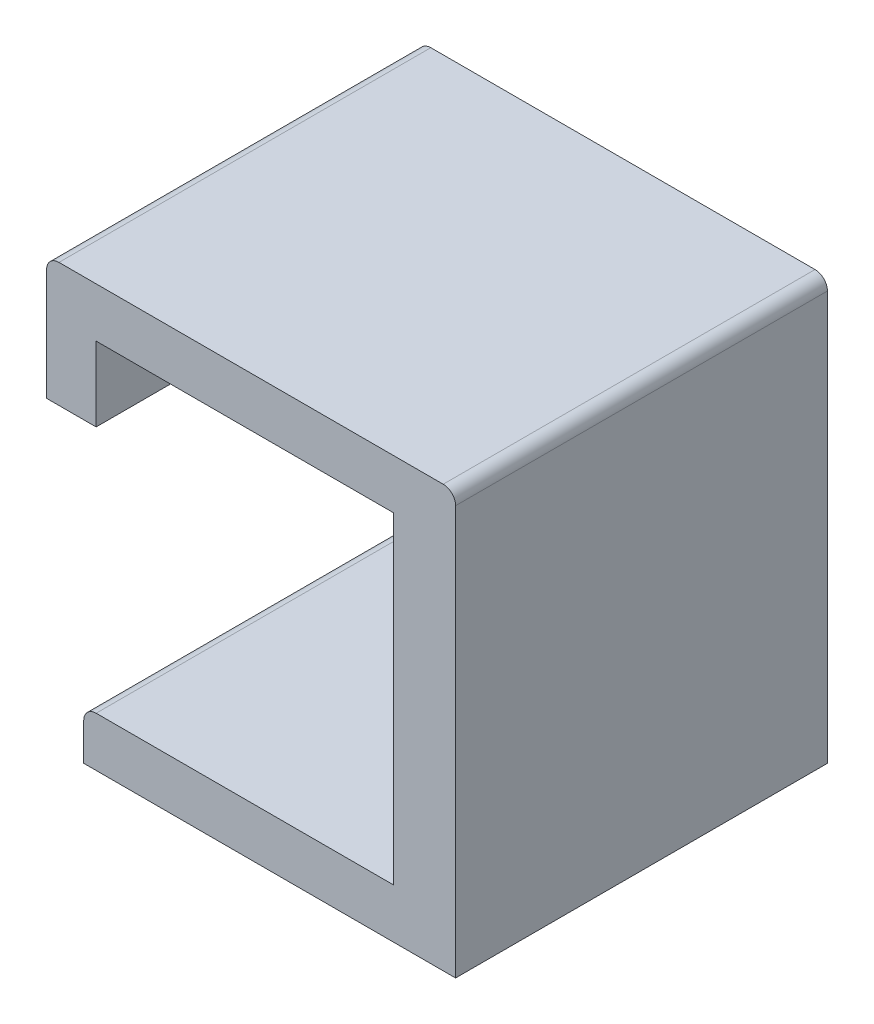
ISO-10303-21;
HEADER;
FILE_DESCRIPTION(('STEP AP214'),'2;1');
FILE_NAME('part.step','',(''),(''),'','','');
FILE_SCHEMA(('AUTOMOTIVE_DESIGN { 1 0 10303 214 1 1 1 1 }'));
ENDSEC;
DATA;
#1=APPLICATION_CONTEXT('core data for automotive mechanical design processes');
#2=APPLICATION_PROTOCOL_DEFINITION('international standard','automotive_design',2000,#1);
#3=PRODUCT_CONTEXT('',#1,'mechanical');
#4=PRODUCT('Part','Part','',(#3));
#5=PRODUCT_RELATED_PRODUCT_CATEGORY('part','',(#4));
#6=PRODUCT_DEFINITION_FORMATION('','',#4);
#7=PRODUCT_DEFINITION_CONTEXT('part definition',#1,'design');
#8=PRODUCT_DEFINITION('design','',#6,#7);
#9=PRODUCT_DEFINITION_SHAPE('','',#8);
#10=(LENGTH_UNIT() NAMED_UNIT(*) SI_UNIT(.MILLI.,.METRE.));
#11=(NAMED_UNIT(*) PLANE_ANGLE_UNIT() SI_UNIT($,.RADIAN.));
#12=(NAMED_UNIT(*) SI_UNIT($,.STERADIAN.) SOLID_ANGLE_UNIT());
#13=UNCERTAINTY_MEASURE_WITH_UNIT(LENGTH_MEASURE(1.E-05),#10,'distance_accuracy_value','');
#14=(GEOMETRIC_REPRESENTATION_CONTEXT(3) GLOBAL_UNCERTAINTY_ASSIGNED_CONTEXT((#13)) GLOBAL_UNIT_ASSIGNED_CONTEXT((#10,
#11,#12)) REPRESENTATION_CONTEXT('',''));
#15=CARTESIAN_POINT('',(0.,0.,0.));
#16=DIRECTION('',(0.,0.,1.));
#17=DIRECTION('',(1.,0.,0.));
#18=AXIS2_PLACEMENT_3D('',#15,#16,#17);
#19=CARTESIAN_POINT('',(-3.,30.,-30.));
#20=DIRECTION('',(0.,1.,0.));
#21=DIRECTION('',(0.,0.,1.));
#22=AXIS2_PLACEMENT_3D('',#19,#20,#21);
#23=PLANE('',#22);
#24=DIRECTION('',(0.,0.,1.));
#25=VECTOR('',#24,1.);
#26=CARTESIAN_POINT('',(0.999999999999997,30.,-30.));
#27=LINE('',#26,#25);
#28=CARTESIAN_POINT('',(0.999999999999997,30.,-30.));
#29=VERTEX_POINT('',#28);
#30=CARTESIAN_POINT('',(0.999999999999997,30.,0.));
#31=VERTEX_POINT('',#30);
#32=EDGE_CURVE('E153',#29,#31,#27,.T.);
#33=ORIENTED_EDGE('',*,*,#32,.F.);
#34=DIRECTION('',(1.,0.,0.));
#35=VECTOR('',#34,1.);
#36=CARTESIAN_POINT('',(-3.,30.,-30.));
#37=LINE('',#36,#35);
#38=CARTESIAN_POINT('',(25.,30.,-30.));
#39=VERTEX_POINT('',#38);
#40=EDGE_CURVE('E159',#29,#39,#37,.T.);
#41=ORIENTED_EDGE('',*,*,#40,.T.);
#42=DIRECTION('',(0.,0.,1.));
#43=VECTOR('',#42,1.);
#44=CARTESIAN_POINT('',(25.,30.,-30.));
#45=LINE('',#44,#43);
#46=CARTESIAN_POINT('',(25.,30.,0.));
#47=VERTEX_POINT('',#46);
#48=EDGE_CURVE('E161',#39,#47,#45,.T.);
#49=ORIENTED_EDGE('',*,*,#48,.T.);
#50=DIRECTION('',(1.,0.,0.));
#51=VECTOR('',#50,1.);
#52=CARTESIAN_POINT('',(-3.,30.,0.));
#53=LINE('',#52,#51);
#54=EDGE_CURVE('E176',#31,#47,#53,.T.);
#55=ORIENTED_EDGE('',*,*,#54,.F.);
#56=EDGE_LOOP('',(#33,#41,#49,#55));
#57=FACE_BOUND('',#56,.T.);
#58=ADVANCED_FACE('F39',(#57),#23,.F.);
#59=CARTESIAN_POINT('',(25.,34.,-30.));
#60=DIRECTION('',(1.,0.,0.));
#61=DIRECTION('',(0.,0.,-1.));
#62=AXIS2_PLACEMENT_3D('',#59,#60,#61);
#63=PLANE('',#62);
#64=ORIENTED_EDGE('',*,*,#48,.F.);
#65=DIRECTION('',(0.,-1.,0.));
#66=VECTOR('',#65,1.);
#67=CARTESIAN_POINT('',(25.,34.,-30.));
#68=LINE('',#67,#66);
#69=CARTESIAN_POINT('',(25.,4.,-30.));
#70=VERTEX_POINT('',#69);
#71=EDGE_CURVE('E197',#39,#70,#68,.T.);
#72=ORIENTED_EDGE('',*,*,#71,.T.);
#73=DIRECTION('',(0.,0.,1.));
#74=VECTOR('',#73,1.);
#75=CARTESIAN_POINT('',(25.,4.,-30.));
#76=LINE('',#75,#74);
#77=CARTESIAN_POINT('',(25.,4.,0.));
#78=VERTEX_POINT('',#77);
#79=EDGE_CURVE('E182',#70,#78,#76,.T.);
#80=ORIENTED_EDGE('',*,*,#79,.T.);
#81=DIRECTION('',(0.,-1.,0.));
#82=VECTOR('',#81,1.);
#83=CARTESIAN_POINT('',(25.,34.,0.));
#84=LINE('',#83,#82);
#85=EDGE_CURVE('E190',#47,#78,#84,.T.);
#86=ORIENTED_EDGE('',*,*,#85,.F.);
#87=EDGE_LOOP('',(#64,#72,#80,#86));
#88=FACE_BOUND('',#87,.T.);
#89=ADVANCED_FACE('F292',(#88),#63,.F.);
#90=CARTESIAN_POINT('',(0.,4.,0.));
#91=DIRECTION('',(0.,0.,-1.));
#92=DIRECTION('',(-1.,0.,0.));
#93=AXIS2_PLACEMENT_3D('',#90,#91,#92);
#94=PLANE('',#93);
#95=DIRECTION('',(1.,0.,0.));
#96=VECTOR('',#95,1.);
#97=CARTESIAN_POINT('',(0.,4.,0.));
#98=LINE('',#97,#96);
#99=CARTESIAN_POINT('',(1.,4.,0.));
#100=VERTEX_POINT('',#99);
#101=EDGE_CURVE('E201',#100,#78,#98,.T.);
#102=ORIENTED_EDGE('',*,*,#101,.F.);
#103=CARTESIAN_POINT('',(1.,3.,0.));
#104=DIRECTION('',(0.,0.,-1.));
#105=DIRECTION('',(-1.,0.,0.));
#106=AXIS2_PLACEMENT_3D('',#103,#104,#105);
#107=CIRCLE('',#106,1.);
#108=CARTESIAN_POINT('',(0.,3.,0.));
#109=VERTEX_POINT('',#108);
#110=EDGE_CURVE('E245',#100,#109,#107,.F.);
#111=ORIENTED_EDGE('',*,*,#110,.T.);
#112=DIRECTION('',(0.,-1.,0.));
#113=VECTOR('',#112,1.);
#114=CARTESIAN_POINT('',(0.,4.,0.));
#115=LINE('',#114,#113);
#116=CARTESIAN_POINT('',(0.,0.,0.));
#117=VERTEX_POINT('',#116);
#118=EDGE_CURVE('E209',#109,#117,#115,.T.);
#119=ORIENTED_EDGE('',*,*,#118,.T.);
#120=DIRECTION('',(1.,0.,0.));
#121=VECTOR('',#120,1.);
#122=CARTESIAN_POINT('',(0.,0.,0.));
#123=LINE('',#122,#121);
#124=CARTESIAN_POINT('',(30.,0.,0.));
#125=VERTEX_POINT('',#124);
#126=EDGE_CURVE('E200',#117,#125,#123,.T.);
#127=ORIENTED_EDGE('',*,*,#126,.T.);
#128=DIRECTION('',(0.,-1.,0.));
#129=VECTOR('',#128,1.);
#130=CARTESIAN_POINT('',(30.,4.,0.));
#131=LINE('',#130,#129);
#132=CARTESIAN_POINT('',(30.,33.,0.));
#133=VERTEX_POINT('',#132);
#134=EDGE_CURVE('E232',#133,#125,#131,.T.);
#135=ORIENTED_EDGE('',*,*,#134,.F.);
#136=CARTESIAN_POINT('',(29.,33.,0.));
#137=DIRECTION('',(0.,0.,-1.));
#138=DIRECTION('',(-1.,0.,0.));
#139=AXIS2_PLACEMENT_3D('',#136,#137,#138);
#140=CIRCLE('',#139,1.);
#141=CARTESIAN_POINT('',(29.,34.,0.));
#142=VERTEX_POINT('',#141);
#143=EDGE_CURVE('E239',#133,#142,#140,.F.);
#144=ORIENTED_EDGE('',*,*,#143,.T.);
#145=DIRECTION('',(1.,0.,0.));
#146=VECTOR('',#145,1.);
#147=CARTESIAN_POINT('',(30.,34.,0.));
#148=LINE('',#147,#146);
#149=CARTESIAN_POINT('',(-2.,34.,0.));
#150=VERTEX_POINT('',#149);
#151=EDGE_CURVE('E186',#150,#142,#148,.T.);
#152=ORIENTED_EDGE('',*,*,#151,.F.);
#153=CARTESIAN_POINT('',(-2.,33.,0.));
#154=DIRECTION('',(0.,0.,-1.));
#155=DIRECTION('',(-1.,0.,0.));
#156=AXIS2_PLACEMENT_3D('',#153,#154,#155);
#157=CIRCLE('',#156,1.);
#158=CARTESIAN_POINT('',(-3.,33.,0.));
#159=VERTEX_POINT('',#158);
#160=EDGE_CURVE('E242',#150,#159,#157,.F.);
#161=ORIENTED_EDGE('',*,*,#160,.T.);
#162=DIRECTION('',(0.,1.,0.));
#163=VECTOR('',#162,1.);
#164=CARTESIAN_POINT('',(-3.,34.,0.));
#165=LINE('',#164,#163);
#166=CARTESIAN_POINT('',(-3.,24.,0.));
#167=VERTEX_POINT('',#166);
#168=EDGE_CURVE('E173',#167,#159,#165,.T.);
#169=ORIENTED_EDGE('',*,*,#168,.F.);
#170=DIRECTION('',(-1.,0.,0.));
#171=VECTOR('',#170,1.);
#172=CARTESIAN_POINT('',(-3.,24.,0.));
#173=LINE('',#172,#171);
#174=CARTESIAN_POINT('',(0.999999999999997,24.,0.));
#175=VERTEX_POINT('',#174);
#176=EDGE_CURVE('E144',#175,#167,#173,.T.);
#177=ORIENTED_EDGE('',*,*,#176,.F.);
#178=DIRECTION('',(0.,1.,0.));
#179=VECTOR('',#178,1.);
#180=CARTESIAN_POINT('',(0.999999999999997,24.,0.));
#181=LINE('',#180,#179);
#182=EDGE_CURVE('E139',#175,#31,#181,.T.);
#183=ORIENTED_EDGE('',*,*,#182,.T.);
#184=ORIENTED_EDGE('',*,*,#54,.T.);
#185=ORIENTED_EDGE('',*,*,#85,.T.);
#186=EDGE_LOOP('',(#102,#111,#119,#127,#135,#144,#152,#161,#169,#177,#183,#184,#185));
#187=FACE_BOUND('',#186,.T.);
#188=ADVANCED_FACE('F275',(#187),#94,.F.);
#189=CARTESIAN_POINT('',(30.,4.,0.));
#190=DIRECTION('',(-1.,0.,0.));
#191=DIRECTION('',(0.,0.,1.));
#192=AXIS2_PLACEMENT_3D('',#189,#190,#191);
#193=PLANE('',#192);
#194=DIRECTION('',(0.,-1.,0.));
#195=VECTOR('',#194,1.);
#196=CARTESIAN_POINT('',(30.,4.,-30.));
#197=LINE('',#196,#195);
#198=CARTESIAN_POINT('',(30.,33.,-30.));
#199=VERTEX_POINT('',#198);
#200=CARTESIAN_POINT('',(30.,0.,-30.));
#201=VERTEX_POINT('',#200);
#202=EDGE_CURVE('E229',#199,#201,#197,.T.);
#203=ORIENTED_EDGE('',*,*,#202,.F.);
#204=DIRECTION('',(0.,0.,-1.));
#205=VECTOR('',#204,1.);
#206=CARTESIAN_POINT('',(30.,33.,0.));
#207=LINE('',#206,#205);
#208=EDGE_CURVE('E11',#199,#133,#207,.F.);
#209=ORIENTED_EDGE('',*,*,#208,.T.);
#210=ORIENTED_EDGE('',*,*,#134,.T.);
#211=DIRECTION('',(0.,0.,-1.));
#212=VECTOR('',#211,1.);
#213=CARTESIAN_POINT('',(30.,0.,0.));
#214=LINE('',#213,#212);
#215=EDGE_CURVE('E213',#125,#201,#214,.T.);
#216=ORIENTED_EDGE('',*,*,#215,.T.);
#217=EDGE_LOOP('',(#203,#209,#210,#216));
#218=FACE_BOUND('',#217,.T.);
#219=ADVANCED_FACE('F314',(#218),#193,.F.);
#220=CARTESIAN_POINT('',(0.,4.,-30.));
#221=DIRECTION('',(0.,0.,1.));
#222=DIRECTION('',(1.,0.,0.));
#223=AXIS2_PLACEMENT_3D('',#220,#221,#222);
#224=PLANE('',#223);
#225=DIRECTION('',(0.,-1.,0.));
#226=VECTOR('',#225,1.);
#227=CARTESIAN_POINT('',(0.,4.,-30.));
#228=LINE('',#227,#226);
#229=CARTESIAN_POINT('',(0.,3.,-30.));
#230=VERTEX_POINT('',#229);
#231=CARTESIAN_POINT('',(0.,0.,-30.));
#232=VERTEX_POINT('',#231);
#233=EDGE_CURVE('E226',#230,#232,#228,.T.);
#234=ORIENTED_EDGE('',*,*,#233,.F.);
#235=CARTESIAN_POINT('',(1.,3.,-30.));
#236=DIRECTION('',(0.,0.,1.));
#237=DIRECTION('',(1.,0.,0.));
#238=AXIS2_PLACEMENT_3D('',#235,#236,#237);
#239=CIRCLE('',#238,1.);
#240=CARTESIAN_POINT('',(1.,4.,-30.));
#241=VERTEX_POINT('',#240);
#242=EDGE_CURVE('E255',#230,#241,#239,.F.);
#243=ORIENTED_EDGE('',*,*,#242,.T.);
#244=DIRECTION('',(-1.,0.,0.));
#245=VECTOR('',#244,1.);
#246=CARTESIAN_POINT('',(0.,4.,-30.));
#247=LINE('',#246,#245);
#248=EDGE_CURVE('E204',#70,#241,#247,.T.);
#249=ORIENTED_EDGE('',*,*,#248,.F.);
#250=ORIENTED_EDGE('',*,*,#71,.F.);
#251=ORIENTED_EDGE('',*,*,#40,.F.);
#252=DIRECTION('',(0.,1.,0.));
#253=VECTOR('',#252,1.);
#254=CARTESIAN_POINT('',(0.999999999999997,24.,-30.));
#255=LINE('',#254,#253);
#256=CARTESIAN_POINT('',(0.999999999999997,24.,-30.));
#257=VERTEX_POINT('',#256);
#258=EDGE_CURVE('E136',#257,#29,#255,.T.);
#259=ORIENTED_EDGE('',*,*,#258,.F.);
#260=DIRECTION('',(1.,0.,0.));
#261=VECTOR('',#260,1.);
#262=CARTESIAN_POINT('',(-3.,24.,-30.));
#263=LINE('',#262,#261);
#264=CARTESIAN_POINT('',(-3.,24.,-30.));
#265=VERTEX_POINT('',#264);
#266=EDGE_CURVE('E145',#265,#257,#263,.T.);
#267=ORIENTED_EDGE('',*,*,#266,.F.);
#268=DIRECTION('',(0.,-1.,0.));
#269=VECTOR('',#268,1.);
#270=CARTESIAN_POINT('',(-3.,34.,-30.));
#271=LINE('',#270,#269);
#272=CARTESIAN_POINT('',(-3.,33.,-30.));
#273=VERTEX_POINT('',#272);
#274=EDGE_CURVE('E166',#273,#265,#271,.T.);
#275=ORIENTED_EDGE('',*,*,#274,.F.);
#276=CARTESIAN_POINT('',(-2.,33.,-30.));
#277=DIRECTION('',(0.,0.,1.));
#278=DIRECTION('',(1.,0.,0.));
#279=AXIS2_PLACEMENT_3D('',#276,#277,#278);
#280=CIRCLE('',#279,1.);
#281=CARTESIAN_POINT('',(-2.,34.,-30.));
#282=VERTEX_POINT('',#281);
#283=EDGE_CURVE('E61',#273,#282,#280,.F.);
#284=ORIENTED_EDGE('',*,*,#283,.T.);
#285=DIRECTION('',(-1.,0.,0.));
#286=VECTOR('',#285,1.);
#287=CARTESIAN_POINT('',(30.,34.,-30.));
#288=LINE('',#287,#286);
#289=CARTESIAN_POINT('',(29.,34.,-30.));
#290=VERTEX_POINT('',#289);
#291=EDGE_CURVE('E183',#290,#282,#288,.T.);
#292=ORIENTED_EDGE('',*,*,#291,.F.);
#293=CARTESIAN_POINT('',(29.,33.,-30.));
#294=DIRECTION('',(0.,0.,1.));
#295=DIRECTION('',(1.,0.,0.));
#296=AXIS2_PLACEMENT_3D('',#293,#294,#295);
#297=CIRCLE('',#296,1.);
#298=EDGE_CURVE('E55',#290,#199,#297,.F.);
#299=ORIENTED_EDGE('',*,*,#298,.T.);
#300=ORIENTED_EDGE('',*,*,#202,.T.);
#301=DIRECTION('',(-1.,0.,0.));
#302=VECTOR('',#301,1.);
#303=CARTESIAN_POINT('',(0.,0.,-30.));
#304=LINE('',#303,#302);
#305=EDGE_CURVE('E217',#201,#232,#304,.T.);
#306=ORIENTED_EDGE('',*,*,#305,.T.);
#307=EDGE_LOOP('',(#234,#243,#249,#250,#251,#259,#267,#275,#284,#292,#299,#300,#306));
#308=FACE_BOUND('',#307,.T.);
#309=ADVANCED_FACE('F157',(#308),#224,.F.);
#310=CARTESIAN_POINT('',(0.,4.,0.));
#311=DIRECTION('',(1.,0.,0.));
#312=DIRECTION('',(0.,0.,-1.));
#313=AXIS2_PLACEMENT_3D('',#310,#311,#312);
#314=PLANE('',#313);
#315=ORIENTED_EDGE('',*,*,#118,.F.);
#316=DIRECTION('',(0.,0.,1.));
#317=VECTOR('',#316,1.);
#318=CARTESIAN_POINT('',(0.,3.,-30.));
#319=LINE('',#318,#317);
#320=EDGE_CURVE('E248',#109,#230,#319,.F.);
#321=ORIENTED_EDGE('',*,*,#320,.T.);
#322=ORIENTED_EDGE('',*,*,#233,.T.);
#323=DIRECTION('',(0.,0.,1.));
#324=VECTOR('',#323,1.);
#325=CARTESIAN_POINT('',(0.,0.,0.));
#326=LINE('',#325,#324);
#327=EDGE_CURVE('E205',#232,#117,#326,.T.);
#328=ORIENTED_EDGE('',*,*,#327,.T.);
#329=EDGE_LOOP('',(#315,#321,#322,#328));
#330=FACE_BOUND('',#329,.T.);
#331=ADVANCED_FACE('F304',(#330),#314,.F.);
#332=CARTESIAN_POINT('',(0.,4.,0.));
#333=DIRECTION('',(0.,1.,0.));
#334=DIRECTION('',(0.,0.,1.));
#335=AXIS2_PLACEMENT_3D('',#332,#333,#334);
#336=PLANE('',#335);
#337=ORIENTED_EDGE('',*,*,#248,.T.);
#338=DIRECTION('',(0.,0.,1.));
#339=VECTOR('',#338,1.);
#340=CARTESIAN_POINT('',(1.,4.,0.));
#341=LINE('',#340,#339);
#342=EDGE_CURVE('E235',#241,#100,#341,.T.);
#343=ORIENTED_EDGE('',*,*,#342,.T.);
#344=ORIENTED_EDGE('',*,*,#101,.T.);
#345=ORIENTED_EDGE('',*,*,#79,.F.);
#346=EDGE_LOOP('',(#337,#343,#344,#345));
#347=FACE_BOUND('',#346,.T.);
#348=ADVANCED_FACE('F296',(#347),#336,.T.);
#349=CARTESIAN_POINT('',(0.,0.,0.));
#350=DIRECTION('',(0.,1.,0.));
#351=DIRECTION('',(0.,0.,1.));
#352=AXIS2_PLACEMENT_3D('',#349,#350,#351);
#353=PLANE('',#352);
#354=ORIENTED_EDGE('',*,*,#126,.F.);
#355=ORIENTED_EDGE('',*,*,#327,.F.);
#356=ORIENTED_EDGE('',*,*,#305,.F.);
#357=ORIENTED_EDGE('',*,*,#215,.F.);
#358=EDGE_LOOP('',(#354,#355,#356,#357));
#359=FACE_BOUND('',#358,.T.);
#360=ADVANCED_FACE('F310',(#359),#353,.F.);
#361=CARTESIAN_POINT('',(0.,34.,0.));
#362=DIRECTION('',(0.,1.,0.));
#363=DIRECTION('',(0.,0.,1.));
#364=AXIS2_PLACEMENT_3D('',#361,#362,#363);
#365=PLANE('',#364);
#366=ORIENTED_EDGE('',*,*,#291,.T.);
#367=DIRECTION('',(0.,0.,-1.));
#368=VECTOR('',#367,1.);
#369=CARTESIAN_POINT('',(-2.,34.,0.));
#370=LINE('',#369,#368);
#371=EDGE_CURVE('E48',#282,#150,#370,.F.);
#372=ORIENTED_EDGE('',*,*,#371,.T.);
#373=ORIENTED_EDGE('',*,*,#151,.T.);
#374=DIRECTION('',(0.,0.,-1.));
#375=VECTOR('',#374,1.);
#376=CARTESIAN_POINT('',(29.,34.,-30.));
#377=LINE('',#376,#375);
#378=EDGE_CURVE('E262',#142,#290,#377,.T.);
#379=ORIENTED_EDGE('',*,*,#378,.T.);
#380=EDGE_LOOP('',(#366,#372,#373,#379));
#381=FACE_BOUND('',#380,.T.);
#382=ADVANCED_FACE('F269',(#381),#365,.T.);
#383=CARTESIAN_POINT('',(-3.,0.,0.));
#384=DIRECTION('',(-1.,0.,0.));
#385=DIRECTION('',(0.,0.,1.));
#386=AXIS2_PLACEMENT_3D('',#383,#384,#385);
#387=PLANE('',#386);
#388=ORIENTED_EDGE('',*,*,#168,.T.);
#389=DIRECTION('',(0.,0.,-1.));
#390=VECTOR('',#389,1.);
#391=CARTESIAN_POINT('',(-3.,33.,0.));
#392=LINE('',#391,#390);
#393=EDGE_CURVE('E258',#159,#273,#392,.T.);
#394=ORIENTED_EDGE('',*,*,#393,.T.);
#395=ORIENTED_EDGE('',*,*,#274,.T.);
#396=DIRECTION('',(0.,0.,-1.));
#397=VECTOR('',#396,1.);
#398=CARTESIAN_POINT('',(-3.,24.,-30.));
#399=LINE('',#398,#397);
#400=EDGE_CURVE('E151',#167,#265,#399,.T.);
#401=ORIENTED_EDGE('',*,*,#400,.F.);
#402=EDGE_LOOP('',(#388,#394,#395,#401));
#403=FACE_BOUND('',#402,.T.);
#404=ADVANCED_FACE('F281',(#403),#387,.T.);
#405=CARTESIAN_POINT('',(0.999999999999997,24.,-30.));
#406=DIRECTION('',(-1.,0.,0.));
#407=DIRECTION('',(0.,0.,1.));
#408=AXIS2_PLACEMENT_3D('',#405,#406,#407);
#409=PLANE('',#408);
#410=ORIENTED_EDGE('',*,*,#32,.T.);
#411=ORIENTED_EDGE('',*,*,#182,.F.);
#412=DIRECTION('',(0.,0.,1.));
#413=VECTOR('',#412,1.);
#414=CARTESIAN_POINT('',(0.999999999999997,24.,-30.));
#415=LINE('',#414,#413);
#416=EDGE_CURVE('E132',#257,#175,#415,.T.);
#417=ORIENTED_EDGE('',*,*,#416,.F.);
#418=ORIENTED_EDGE('',*,*,#258,.T.);
#419=EDGE_LOOP('',(#410,#411,#417,#418));
#420=FACE_BOUND('',#419,.T.);
#421=ADVANCED_FACE('F134',(#420),#409,.F.);
#422=CARTESIAN_POINT('',(0.,24.,0.));
#423=DIRECTION('',(0.,-1.,0.));
#424=DIRECTION('',(0.,0.,-1.));
#425=AXIS2_PLACEMENT_3D('',#422,#423,#424);
#426=PLANE('',#425);
#427=ORIENTED_EDGE('',*,*,#266,.T.);
#428=ORIENTED_EDGE('',*,*,#416,.T.);
#429=ORIENTED_EDGE('',*,*,#176,.T.);
#430=ORIENTED_EDGE('',*,*,#400,.T.);
#431=EDGE_LOOP('',(#427,#428,#429,#430));
#432=FACE_BOUND('',#431,.T.);
#433=ADVANCED_FACE('F149',(#432),#426,.T.);
#434=CARTESIAN_POINT('',(1.,3.,0.));
#435=DIRECTION('',(0.,0.,-1.));
#436=DIRECTION('',(-1.,0.,0.));
#437=AXIS2_PLACEMENT_3D('',#434,#435,#436);
#438=CYLINDRICAL_SURFACE('',#437,1.);
#439=ORIENTED_EDGE('',*,*,#242,.F.);
#440=ORIENTED_EDGE('',*,*,#320,.F.);
#441=ORIENTED_EDGE('',*,*,#110,.F.);
#442=ORIENTED_EDGE('',*,*,#342,.F.);
#443=EDGE_LOOP('',(#439,#440,#441,#442));
#444=FACE_BOUND('',#443,.T.);
#445=ADVANCED_FACE('F301',(#444),#438,.T.);
#446=CARTESIAN_POINT('',(-2.,33.,0.));
#447=DIRECTION('',(0.,0.,-1.));
#448=DIRECTION('',(-1.,0.,0.));
#449=AXIS2_PLACEMENT_3D('',#446,#447,#448);
#450=CYLINDRICAL_SURFACE('',#449,1.);
#451=ORIENTED_EDGE('',*,*,#160,.F.);
#452=ORIENTED_EDGE('',*,*,#371,.F.);
#453=ORIENTED_EDGE('',*,*,#283,.F.);
#454=ORIENTED_EDGE('',*,*,#393,.F.);
#455=EDGE_LOOP('',(#451,#452,#453,#454));
#456=FACE_BOUND('',#455,.T.);
#457=ADVANCED_FACE('F279',(#456),#450,.T.);
#458=CARTESIAN_POINT('',(29.,33.,0.));
#459=DIRECTION('',(0.,0.,1.));
#460=DIRECTION('',(1.,0.,0.));
#461=AXIS2_PLACEMENT_3D('',#458,#459,#460);
#462=CYLINDRICAL_SURFACE('',#461,1.);
#463=ORIENTED_EDGE('',*,*,#143,.F.);
#464=ORIENTED_EDGE('',*,*,#208,.F.);
#465=ORIENTED_EDGE('',*,*,#298,.F.);
#466=ORIENTED_EDGE('',*,*,#378,.F.);
#467=EDGE_LOOP('',(#463,#464,#465,#466));
#468=FACE_BOUND('',#467,.T.);
#469=ADVANCED_FACE('F41',(#468),#462,.T.);
#470=CLOSED_SHELL('',(#58,#89,#188,#219,#309,#331,#348,#360,#382,#404,#421,#433,#445,#457,#469));
#471=MANIFOLD_SOLID_BREP('B2',#470);
#472=ADVANCED_BREP_SHAPE_REPRESENTATION('',(#18,#471),#14);
#473=SHAPE_DEFINITION_REPRESENTATION(#9,#472);
ENDSEC;
END-ISO-10303-21;
